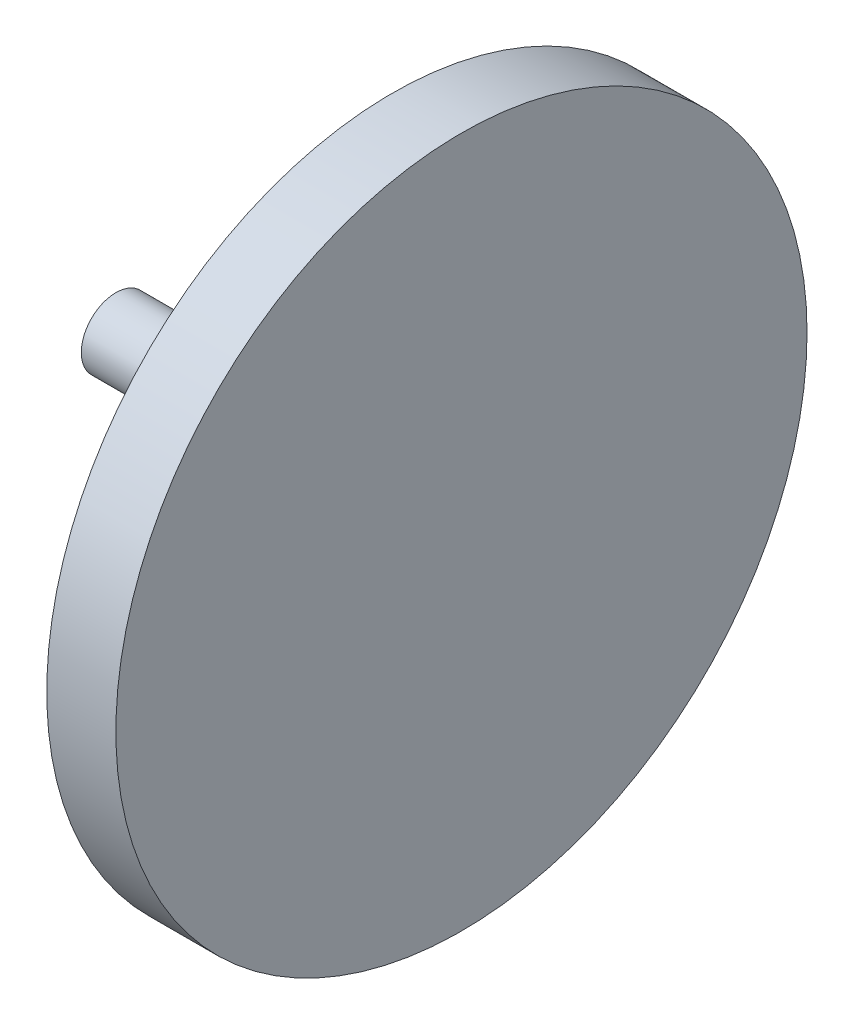
ISO-10303-21;
HEADER;
FILE_DESCRIPTION(('STEP AP214'),'2;1');
FILE_NAME('part.step','',(''),(''),'','','');
FILE_SCHEMA(('AUTOMOTIVE_DESIGN { 1 0 10303 214 1 1 1 1 }'));
ENDSEC;
DATA;
#1=APPLICATION_CONTEXT('core data for automotive mechanical design processes');
#2=APPLICATION_PROTOCOL_DEFINITION('international standard','automotive_design',2000,#1);
#3=PRODUCT_CONTEXT('',#1,'mechanical');
#4=PRODUCT('Part','Part','',(#3));
#5=PRODUCT_RELATED_PRODUCT_CATEGORY('part','',(#4));
#6=PRODUCT_DEFINITION_FORMATION('','',#4);
#7=PRODUCT_DEFINITION_CONTEXT('part definition',#1,'design');
#8=PRODUCT_DEFINITION('design','',#6,#7);
#9=PRODUCT_DEFINITION_SHAPE('','',#8);
#10=(LENGTH_UNIT() NAMED_UNIT(*) SI_UNIT(.MILLI.,.METRE.));
#11=(NAMED_UNIT(*) PLANE_ANGLE_UNIT() SI_UNIT($,.RADIAN.));
#12=(NAMED_UNIT(*) SI_UNIT($,.STERADIAN.) SOLID_ANGLE_UNIT());
#13=UNCERTAINTY_MEASURE_WITH_UNIT(LENGTH_MEASURE(1.E-05),#10,'distance_accuracy_value','');
#14=(GEOMETRIC_REPRESENTATION_CONTEXT(3) GLOBAL_UNCERTAINTY_ASSIGNED_CONTEXT((#13)) GLOBAL_UNIT_ASSIGNED_CONTEXT((#10,
#11,#12)) REPRESENTATION_CONTEXT('',''));
#15=CARTESIAN_POINT('',(0.,0.,0.));
#16=DIRECTION('',(0.,0.,1.));
#17=DIRECTION('',(1.,0.,0.));
#18=AXIS2_PLACEMENT_3D('',#15,#16,#17);
#19=CARTESIAN_POINT('',(-5.,0.,0.));
#20=DIRECTION('',(1.,0.,0.));
#21=DIRECTION('',(0.,0.,-1.));
#22=AXIS2_PLACEMENT_3D('',#19,#20,#21);
#23=CYLINDRICAL_SURFACE('',#22,2.5);
#24=CARTESIAN_POINT('',(-5.,0.,0.));
#25=DIRECTION('',(1.,0.,0.));
#26=DIRECTION('',(0.,0.,-1.));
#27=AXIS2_PLACEMENT_3D('',#24,#25,#26);
#28=CIRCLE('',#27,2.5);
#29=CARTESIAN_POINT('',(-5.,0.,-2.5));
#30=VERTEX_POINT('',#29);
#31=EDGE_CURVE('E10',#30,#30,#28,.T.);
#32=ORIENTED_EDGE('',*,*,#31,.T.);
#33=EDGE_LOOP('',(#32));
#34=FACE_BOUND('',#33,.T.);
#35=CARTESIAN_POINT('',(15.,0.,0.));
#36=DIRECTION('',(1.,0.,0.));
#37=DIRECTION('',(0.,0.,-1.));
#38=AXIS2_PLACEMENT_3D('',#35,#36,#37);
#39=CIRCLE('',#38,2.5);
#40=CARTESIAN_POINT('',(15.,0.,-2.5));
#41=VERTEX_POINT('',#40);
#42=EDGE_CURVE('E48',#41,#41,#39,.T.);
#43=ORIENTED_EDGE('',*,*,#42,.F.);
#44=EDGE_LOOP('',(#43));
#45=FACE_BOUND('',#44,.T.);
#46=ADVANCED_FACE('F41',(#34,#45),#23,.T.);
#47=CARTESIAN_POINT('',(-5.,0.,0.));
#48=DIRECTION('',(1.,0.,0.));
#49=DIRECTION('',(0.,0.,-1.));
#50=AXIS2_PLACEMENT_3D('',#47,#48,#49);
#51=PLANE('',#50);
#52=ORIENTED_EDGE('',*,*,#31,.F.);
#53=EDGE_LOOP('',(#52));
#54=FACE_BOUND('',#53,.T.);
#55=ADVANCED_FACE('F78',(#54),#51,.F.);
#56=CARTESIAN_POINT('',(20.,0.,0.));
#57=DIRECTION('',(-1.,0.,0.));
#58=DIRECTION('',(0.,0.,1.));
#59=AXIS2_PLACEMENT_3D('',#56,#57,#58);
#60=CYLINDRICAL_SURFACE('',#59,25.);
#61=CARTESIAN_POINT('',(20.,0.,0.));
#62=DIRECTION('',(1.,0.,0.));
#63=DIRECTION('',(0.,0.,-1.));
#64=AXIS2_PLACEMENT_3D('',#61,#62,#63);
#65=CIRCLE('',#64,25.);
#66=CARTESIAN_POINT('',(20.,0.,-25.));
#67=VERTEX_POINT('',#66);
#68=EDGE_CURVE('E53',#67,#67,#65,.T.);
#69=ORIENTED_EDGE('',*,*,#68,.F.);
#70=EDGE_LOOP('',(#69));
#71=FACE_BOUND('',#70,.T.);
#72=CARTESIAN_POINT('',(15.,0.,0.));
#73=DIRECTION('',(1.,0.,0.));
#74=DIRECTION('',(0.,0.,-1.));
#75=AXIS2_PLACEMENT_3D('',#72,#73,#74);
#76=CIRCLE('',#75,25.);
#77=CARTESIAN_POINT('',(15.,0.,-25.));
#78=VERTEX_POINT('',#77);
#79=EDGE_CURVE('E58',#78,#78,#76,.T.);
#80=ORIENTED_EDGE('',*,*,#79,.T.);
#81=EDGE_LOOP('',(#80));
#82=FACE_BOUND('',#81,.T.);
#83=ADVANCED_FACE('F65',(#71,#82),#60,.T.);
#84=CARTESIAN_POINT('',(20.,0.,0.));
#85=DIRECTION('',(1.,0.,0.));
#86=DIRECTION('',(0.,0.,-1.));
#87=AXIS2_PLACEMENT_3D('',#84,#85,#86);
#88=PLANE('',#87);
#89=ORIENTED_EDGE('',*,*,#68,.T.);
#90=EDGE_LOOP('',(#89));
#91=FACE_BOUND('',#90,.T.);
#92=ADVANCED_FACE('F69',(#91),#88,.T.);
#93=CARTESIAN_POINT('',(15.,0.,0.));
#94=DIRECTION('',(1.,0.,0.));
#95=DIRECTION('',(0.,0.,-1.));
#96=AXIS2_PLACEMENT_3D('',#93,#94,#95);
#97=PLANE('',#96);
#98=ORIENTED_EDGE('',*,*,#42,.T.);
#99=EDGE_LOOP('',(#98));
#100=FACE_BOUND('',#99,.T.);
#101=ORIENTED_EDGE('',*,*,#79,.F.);
#102=EDGE_LOOP('',(#101));
#103=FACE_BOUND('',#102,.T.);
#104=ADVANCED_FACE('F67',(#100,#103),#97,.F.);
#105=CLOSED_SHELL('',(#46,#55,#83,#92,#104));
#106=MANIFOLD_SOLID_BREP('B2',#105);
#107=ADVANCED_BREP_SHAPE_REPRESENTATION('',(#18,#106),#14);
#108=SHAPE_DEFINITION_REPRESENTATION(#9,#107);
ENDSEC;
END-ISO-10303-21;
